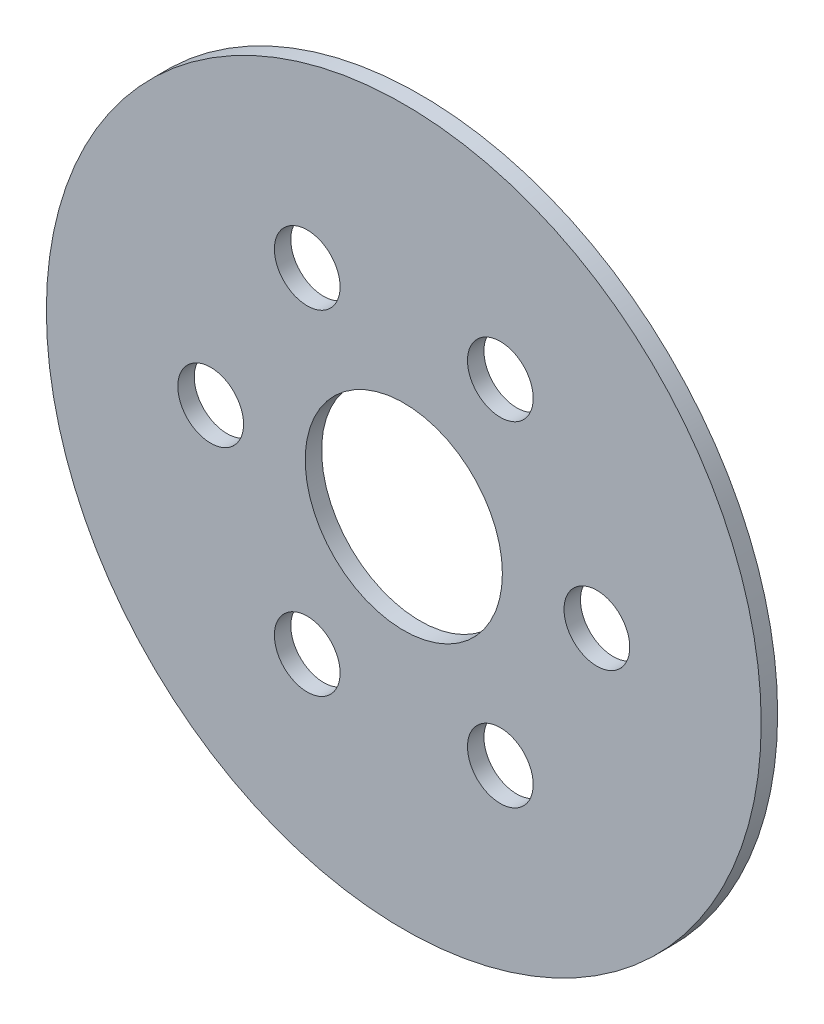
ISO-10303-21;
HEADER;
FILE_DESCRIPTION(('STEP AP214'),'2;1');
FILE_NAME('part.step','',(''),(''),'','','');
FILE_SCHEMA(('AUTOMOTIVE_DESIGN { 1 0 10303 214 1 1 1 1 }'));
ENDSEC;
DATA;
#1=APPLICATION_CONTEXT('core data for automotive mechanical design processes');
#2=APPLICATION_PROTOCOL_DEFINITION('international standard','automotive_design',2000,#1);
#3=PRODUCT_CONTEXT('',#1,'mechanical');
#4=PRODUCT('Part','Part','',(#3));
#5=PRODUCT_RELATED_PRODUCT_CATEGORY('part','',(#4));
#6=PRODUCT_DEFINITION_FORMATION('','',#4);
#7=PRODUCT_DEFINITION_CONTEXT('part definition',#1,'design');
#8=PRODUCT_DEFINITION('design','',#6,#7);
#9=PRODUCT_DEFINITION_SHAPE('','',#8);
#10=(LENGTH_UNIT() NAMED_UNIT(*) SI_UNIT(.MILLI.,.METRE.));
#11=(NAMED_UNIT(*) PLANE_ANGLE_UNIT() SI_UNIT($,.RADIAN.));
#12=(NAMED_UNIT(*) SI_UNIT($,.STERADIAN.) SOLID_ANGLE_UNIT());
#13=UNCERTAINTY_MEASURE_WITH_UNIT(LENGTH_MEASURE(1.E-05),#10,'distance_accuracy_value','');
#14=(GEOMETRIC_REPRESENTATION_CONTEXT(3) GLOBAL_UNCERTAINTY_ASSIGNED_CONTEXT((#13)) GLOBAL_UNIT_ASSIGNED_CONTEXT((#10,
#11,#12)) REPRESENTATION_CONTEXT('',''));
#15=CARTESIAN_POINT('',(0.,0.,0.));
#16=DIRECTION('',(0.,0.,1.));
#17=DIRECTION('',(1.,0.,0.));
#18=AXIS2_PLACEMENT_3D('',#15,#16,#17);
#19=CARTESIAN_POINT('',(0.,0.,1.));
#20=DIRECTION('',(0.,0.,1.));
#21=DIRECTION('',(1.,0.,0.));
#22=AXIS2_PLACEMENT_3D('',#19,#20,#21);
#23=PLANE('',#22);
#24=CARTESIAN_POINT('',(-5.87499999999991,10.1757984944672,1.));
#25=DIRECTION('',(0.,0.,1.));
#26=DIRECTION('',(1.,0.,0.));
#27=AXIS2_PLACEMENT_3D('',#24,#25,#26);
#28=CIRCLE('',#27,2.);
#29=CARTESIAN_POINT('',(-3.87499999999991,10.1757984944672,1.));
#30=VERTEX_POINT('',#29);
#31=EDGE_CURVE('E77',#30,#30,#28,.T.);
#32=ORIENTED_EDGE('',*,*,#31,.F.);
#33=EDGE_LOOP('',(#32));
#34=FACE_BOUND('',#33,.T.);
#35=CARTESIAN_POINT('',(-5.87500000000005,-10.1757984944671,1.));
#36=DIRECTION('',(0.,0.,1.));
#37=DIRECTION('',(1.,0.,0.));
#38=AXIS2_PLACEMENT_3D('',#35,#36,#37);
#39=CIRCLE('',#38,2.);
#40=CARTESIAN_POINT('',(-3.87500000000005,-10.1757984944671,1.));
#41=VERTEX_POINT('',#40);
#42=EDGE_CURVE('E65',#41,#41,#39,.T.);
#43=ORIENTED_EDGE('',*,*,#42,.F.);
#44=EDGE_LOOP('',(#43));
#45=FACE_BOUND('',#44,.T.);
#46=CARTESIAN_POINT('',(0.,0.,1.));
#47=DIRECTION('',(0.,0.,1.));
#48=DIRECTION('',(1.,0.,0.));
#49=AXIS2_PLACEMENT_3D('',#46,#47,#48);
#50=CIRCLE('',#49,6.);
#51=CARTESIAN_POINT('',(6.,0.,1.));
#52=VERTEX_POINT('',#51);
#53=EDGE_CURVE('E53',#52,#52,#50,.T.);
#54=ORIENTED_EDGE('',*,*,#53,.F.);
#55=EDGE_LOOP('',(#54));
#56=FACE_BOUND('',#55,.T.);
#57=CARTESIAN_POINT('',(0.,0.,1.));
#58=DIRECTION('',(0.,0.,1.));
#59=DIRECTION('',(1.,0.,0.));
#60=AXIS2_PLACEMENT_3D('',#57,#58,#59);
#61=CIRCLE('',#60,21.75);
#62=CARTESIAN_POINT('',(21.75,0.,1.));
#63=VERTEX_POINT('',#62);
#64=EDGE_CURVE('E10',#63,#63,#61,.T.);
#65=ORIENTED_EDGE('',*,*,#64,.T.);
#66=EDGE_LOOP('',(#65));
#67=FACE_BOUND('',#66,.T.);
#68=CARTESIAN_POINT('',(11.75,0.,1.));
#69=DIRECTION('',(0.,0.,1.));
#70=DIRECTION('',(1.,0.,0.));
#71=AXIS2_PLACEMENT_3D('',#68,#69,#70);
#72=CIRCLE('',#71,2.);
#73=CARTESIAN_POINT('',(13.75,0.,1.));
#74=VERTEX_POINT('',#73);
#75=EDGE_CURVE('E48',#74,#74,#72,.T.);
#76=ORIENTED_EDGE('',*,*,#75,.F.);
#77=EDGE_LOOP('',(#76));
#78=FACE_BOUND('',#77,.T.);
#79=CARTESIAN_POINT('',(5.87499999999998,-10.1757984944672,1.));
#80=DIRECTION('',(0.,0.,1.));
#81=DIRECTION('',(1.,0.,0.));
#82=AXIS2_PLACEMENT_3D('',#79,#80,#81);
#83=CIRCLE('',#82,2.);
#84=CARTESIAN_POINT('',(7.87499999999998,-10.1757984944672,1.));
#85=VERTEX_POINT('',#84);
#86=EDGE_CURVE('E59',#85,#85,#83,.T.);
#87=ORIENTED_EDGE('',*,*,#86,.F.);
#88=EDGE_LOOP('',(#87));
#89=FACE_BOUND('',#88,.T.);
#90=CARTESIAN_POINT('',(-11.75,0.,1.));
#91=DIRECTION('',(0.,0.,1.));
#92=DIRECTION('',(1.,0.,0.));
#93=AXIS2_PLACEMENT_3D('',#90,#91,#92);
#94=CIRCLE('',#93,2.);
#95=CARTESIAN_POINT('',(-9.75,0.,1.));
#96=VERTEX_POINT('',#95);
#97=EDGE_CURVE('E71',#96,#96,#94,.T.);
#98=ORIENTED_EDGE('',*,*,#97,.F.);
#99=EDGE_LOOP('',(#98));
#100=FACE_BOUND('',#99,.T.);
#101=CARTESIAN_POINT('',(5.87500000000012,10.1757984944671,1.));
#102=DIRECTION('',(0.,0.,1.));
#103=DIRECTION('',(1.,0.,0.));
#104=AXIS2_PLACEMENT_3D('',#101,#102,#103);
#105=CIRCLE('',#104,2.);
#106=CARTESIAN_POINT('',(7.87500000000012,10.1757984944671,1.));
#107=VERTEX_POINT('',#106);
#108=EDGE_CURVE('E83',#107,#107,#105,.T.);
#109=ORIENTED_EDGE('',*,*,#108,.F.);
#110=EDGE_LOOP('',(#109));
#111=FACE_BOUND('',#110,.T.);
#112=ADVANCED_FACE('F37',(#34,#45,#56,#67,#78,#89,#100,#111),#23,.T.);
#113=CARTESIAN_POINT('',(0.,0.,0.));
#114=DIRECTION('',(0.,0.,1.));
#115=DIRECTION('',(1.,0.,0.));
#116=AXIS2_PLACEMENT_3D('',#113,#114,#115);
#117=PLANE('',#116);
#118=CARTESIAN_POINT('',(0.,0.,0.));
#119=DIRECTION('',(0.,0.,1.));
#120=DIRECTION('',(1.,0.,0.));
#121=AXIS2_PLACEMENT_3D('',#118,#119,#120);
#122=CIRCLE('',#121,21.75);
#123=CARTESIAN_POINT('',(21.75,0.,0.));
#124=VERTEX_POINT('',#123);
#125=EDGE_CURVE('E41',#124,#124,#122,.T.);
#126=ORIENTED_EDGE('',*,*,#125,.F.);
#127=EDGE_LOOP('',(#126));
#128=FACE_BOUND('',#127,.T.);
#129=CARTESIAN_POINT('',(11.75,0.,0.));
#130=DIRECTION('',(0.,0.,1.));
#131=DIRECTION('',(1.,0.,0.));
#132=AXIS2_PLACEMENT_3D('',#129,#130,#131);
#133=CIRCLE('',#132,2.);
#134=CARTESIAN_POINT('',(13.75,0.,0.));
#135=VERTEX_POINT('',#134);
#136=EDGE_CURVE('E50',#135,#135,#133,.T.);
#137=ORIENTED_EDGE('',*,*,#136,.T.);
#138=EDGE_LOOP('',(#137));
#139=FACE_BOUND('',#138,.T.);
#140=CARTESIAN_POINT('',(0.,0.,0.));
#141=DIRECTION('',(0.,0.,1.));
#142=DIRECTION('',(1.,0.,0.));
#143=AXIS2_PLACEMENT_3D('',#140,#141,#142);
#144=CIRCLE('',#143,6.);
#145=CARTESIAN_POINT('',(6.,0.,0.));
#146=VERTEX_POINT('',#145);
#147=EDGE_CURVE('E56',#146,#146,#144,.T.);
#148=ORIENTED_EDGE('',*,*,#147,.T.);
#149=EDGE_LOOP('',(#148));
#150=FACE_BOUND('',#149,.T.);
#151=CARTESIAN_POINT('',(5.87499999999998,-10.1757984944672,0.));
#152=DIRECTION('',(0.,0.,1.));
#153=DIRECTION('',(1.,0.,0.));
#154=AXIS2_PLACEMENT_3D('',#151,#152,#153);
#155=CIRCLE('',#154,2.);
#156=CARTESIAN_POINT('',(7.87499999999998,-10.1757984944672,0.));
#157=VERTEX_POINT('',#156);
#158=EDGE_CURVE('E62',#157,#157,#155,.T.);
#159=ORIENTED_EDGE('',*,*,#158,.T.);
#160=EDGE_LOOP('',(#159));
#161=FACE_BOUND('',#160,.T.);
#162=CARTESIAN_POINT('',(-5.87500000000005,-10.1757984944671,0.));
#163=DIRECTION('',(0.,0.,1.));
#164=DIRECTION('',(1.,0.,0.));
#165=AXIS2_PLACEMENT_3D('',#162,#163,#164);
#166=CIRCLE('',#165,2.);
#167=CARTESIAN_POINT('',(-3.87500000000005,-10.1757984944671,0.));
#168=VERTEX_POINT('',#167);
#169=EDGE_CURVE('E68',#168,#168,#166,.T.);
#170=ORIENTED_EDGE('',*,*,#169,.T.);
#171=EDGE_LOOP('',(#170));
#172=FACE_BOUND('',#171,.T.);
#173=CARTESIAN_POINT('',(-11.75,0.,0.));
#174=DIRECTION('',(0.,0.,1.));
#175=DIRECTION('',(1.,0.,0.));
#176=AXIS2_PLACEMENT_3D('',#173,#174,#175);
#177=CIRCLE('',#176,2.);
#178=CARTESIAN_POINT('',(-9.75,0.,0.));
#179=VERTEX_POINT('',#178);
#180=EDGE_CURVE('E74',#179,#179,#177,.T.);
#181=ORIENTED_EDGE('',*,*,#180,.T.);
#182=EDGE_LOOP('',(#181));
#183=FACE_BOUND('',#182,.T.);
#184=CARTESIAN_POINT('',(-5.87499999999991,10.1757984944672,0.));
#185=DIRECTION('',(0.,0.,1.));
#186=DIRECTION('',(1.,0.,0.));
#187=AXIS2_PLACEMENT_3D('',#184,#185,#186);
#188=CIRCLE('',#187,2.);
#189=CARTESIAN_POINT('',(-3.87499999999991,10.1757984944672,0.));
#190=VERTEX_POINT('',#189);
#191=EDGE_CURVE('E80',#190,#190,#188,.T.);
#192=ORIENTED_EDGE('',*,*,#191,.T.);
#193=EDGE_LOOP('',(#192));
#194=FACE_BOUND('',#193,.T.);
#195=CARTESIAN_POINT('',(5.87500000000012,10.1757984944671,0.));
#196=DIRECTION('',(0.,0.,1.));
#197=DIRECTION('',(1.,0.,0.));
#198=AXIS2_PLACEMENT_3D('',#195,#196,#197);
#199=CIRCLE('',#198,2.);
#200=CARTESIAN_POINT('',(7.87500000000012,10.1757984944671,0.));
#201=VERTEX_POINT('',#200);
#202=EDGE_CURVE('E86',#201,#201,#199,.T.);
#203=ORIENTED_EDGE('',*,*,#202,.T.);
#204=EDGE_LOOP('',(#203));
#205=FACE_BOUND('',#204,.T.);
#206=ADVANCED_FACE('F96',(#128,#139,#150,#161,#172,#183,#194,#205),#117,.F.);
#207=CARTESIAN_POINT('',(0.,0.,1.));
#208=DIRECTION('',(0.,0.,-1.));
#209=DIRECTION('',(-1.,0.,0.));
#210=AXIS2_PLACEMENT_3D('',#207,#208,#209);
#211=CYLINDRICAL_SURFACE('',#210,21.75);
#212=ORIENTED_EDGE('',*,*,#64,.F.);
#213=EDGE_LOOP('',(#212));
#214=FACE_BOUND('',#213,.T.);
#215=ORIENTED_EDGE('',*,*,#125,.T.);
#216=EDGE_LOOP('',(#215));
#217=FACE_BOUND('',#216,.T.);
#218=ADVANCED_FACE('F39',(#214,#217),#211,.T.);
#219=CARTESIAN_POINT('',(11.75,0.,1.));
#220=DIRECTION('',(0.,0.,-1.));
#221=DIRECTION('',(-1.,0.,0.));
#222=AXIS2_PLACEMENT_3D('',#219,#220,#221);
#223=CYLINDRICAL_SURFACE('',#222,2.);
#224=ORIENTED_EDGE('',*,*,#75,.T.);
#225=EDGE_LOOP('',(#224));
#226=FACE_BOUND('',#225,.T.);
#227=ORIENTED_EDGE('',*,*,#136,.F.);
#228=EDGE_LOOP('',(#227));
#229=FACE_BOUND('',#228,.T.);
#230=ADVANCED_FACE('F106',(#226,#229),#223,.F.);
#231=CARTESIAN_POINT('',(0.,0.,1.));
#232=DIRECTION('',(0.,0.,-1.));
#233=DIRECTION('',(-1.,0.,0.));
#234=AXIS2_PLACEMENT_3D('',#231,#232,#233);
#235=CYLINDRICAL_SURFACE('',#234,6.);
#236=ORIENTED_EDGE('',*,*,#53,.T.);
#237=EDGE_LOOP('',(#236));
#238=FACE_BOUND('',#237,.T.);
#239=ORIENTED_EDGE('',*,*,#147,.F.);
#240=EDGE_LOOP('',(#239));
#241=FACE_BOUND('',#240,.T.);
#242=ADVANCED_FACE('F109',(#238,#241),#235,.F.);
#243=CARTESIAN_POINT('',(5.87499999999998,-10.1757984944672,1.));
#244=DIRECTION('',(0.,0.,-1.));
#245=DIRECTION('',(-1.,0.,0.));
#246=AXIS2_PLACEMENT_3D('',#243,#244,#245);
#247=CYLINDRICAL_SURFACE('',#246,2.);
#248=ORIENTED_EDGE('',*,*,#86,.T.);
#249=EDGE_LOOP('',(#248));
#250=FACE_BOUND('',#249,.T.);
#251=ORIENTED_EDGE('',*,*,#158,.F.);
#252=EDGE_LOOP('',(#251));
#253=FACE_BOUND('',#252,.T.);
#254=ADVANCED_FACE('F113',(#250,#253),#247,.F.);
#255=CARTESIAN_POINT('',(-5.87500000000005,-10.1757984944671,1.));
#256=DIRECTION('',(0.,0.,-1.));
#257=DIRECTION('',(-1.,0.,0.));
#258=AXIS2_PLACEMENT_3D('',#255,#256,#257);
#259=CYLINDRICAL_SURFACE('',#258,2.);
#260=ORIENTED_EDGE('',*,*,#42,.T.);
#261=EDGE_LOOP('',(#260));
#262=FACE_BOUND('',#261,.T.);
#263=ORIENTED_EDGE('',*,*,#169,.F.);
#264=EDGE_LOOP('',(#263));
#265=FACE_BOUND('',#264,.T.);
#266=ADVANCED_FACE('F117',(#262,#265),#259,.F.);
#267=CARTESIAN_POINT('',(-11.75,0.,1.));
#268=DIRECTION('',(0.,0.,-1.));
#269=DIRECTION('',(-1.,0.,0.));
#270=AXIS2_PLACEMENT_3D('',#267,#268,#269);
#271=CYLINDRICAL_SURFACE('',#270,2.);
#272=ORIENTED_EDGE('',*,*,#97,.T.);
#273=EDGE_LOOP('',(#272));
#274=FACE_BOUND('',#273,.T.);
#275=ORIENTED_EDGE('',*,*,#180,.F.);
#276=EDGE_LOOP('',(#275));
#277=FACE_BOUND('',#276,.T.);
#278=ADVANCED_FACE('F121',(#274,#277),#271,.F.);
#279=CARTESIAN_POINT('',(-5.87499999999991,10.1757984944672,1.));
#280=DIRECTION('',(0.,0.,-1.));
#281=DIRECTION('',(-1.,0.,0.));
#282=AXIS2_PLACEMENT_3D('',#279,#280,#281);
#283=CYLINDRICAL_SURFACE('',#282,2.);
#284=ORIENTED_EDGE('',*,*,#31,.T.);
#285=EDGE_LOOP('',(#284));
#286=FACE_BOUND('',#285,.T.);
#287=ORIENTED_EDGE('',*,*,#191,.F.);
#288=EDGE_LOOP('',(#287));
#289=FACE_BOUND('',#288,.T.);
#290=ADVANCED_FACE('F125',(#286,#289),#283,.F.);
#291=CARTESIAN_POINT('',(5.87500000000012,10.1757984944671,1.));
#292=DIRECTION('',(0.,0.,-1.));
#293=DIRECTION('',(-1.,0.,0.));
#294=AXIS2_PLACEMENT_3D('',#291,#292,#293);
#295=CYLINDRICAL_SURFACE('',#294,2.);
#296=ORIENTED_EDGE('',*,*,#108,.T.);
#297=EDGE_LOOP('',(#296));
#298=FACE_BOUND('',#297,.T.);
#299=ORIENTED_EDGE('',*,*,#202,.F.);
#300=EDGE_LOOP('',(#299));
#301=FACE_BOUND('',#300,.T.);
#302=ADVANCED_FACE('F92',(#298,#301),#295,.F.);
#303=CLOSED_SHELL('',(#112,#206,#218,#230,#242,#254,#266,#278,#290,#302));
#304=MANIFOLD_SOLID_BREP('B2',#303);
#305=ADVANCED_BREP_SHAPE_REPRESENTATION('',(#18,#304),#14);
#306=SHAPE_DEFINITION_REPRESENTATION(#9,#305);
ENDSEC;
END-ISO-10303-21;
